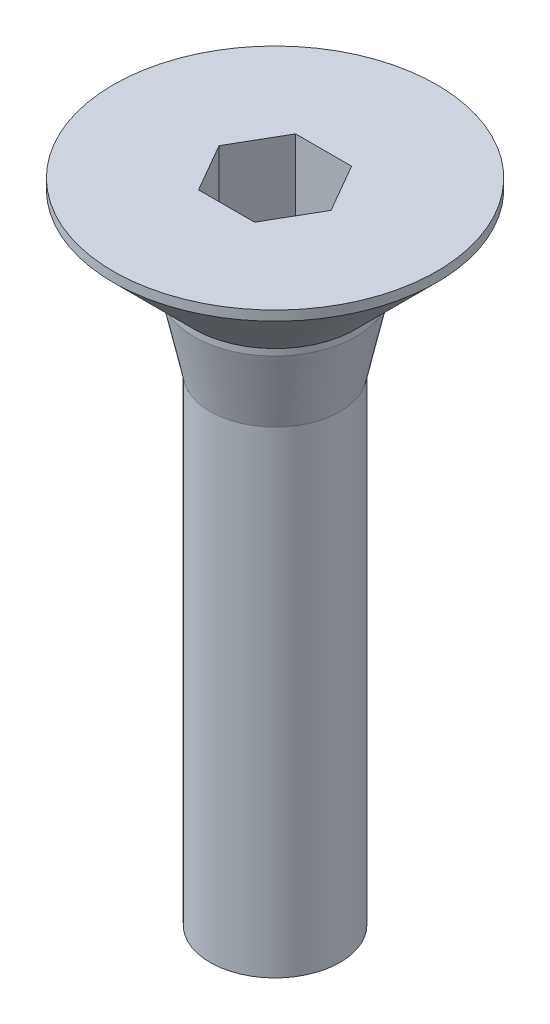
ISO-10303-21;
HEADER;
FILE_DESCRIPTION(('STEP AP214'),'2;1');
FILE_NAME('part.step','',(''),(''),'','','');
FILE_SCHEMA(('AUTOMOTIVE_DESIGN { 1 0 10303 214 1 1 1 1 }'));
ENDSEC;
DATA;
#1=APPLICATION_CONTEXT('core data for automotive mechanical design processes');
#2=APPLICATION_PROTOCOL_DEFINITION('international standard','automotive_design',2000,#1);
#3=PRODUCT_CONTEXT('',#1,'mechanical');
#4=PRODUCT('Part','Part','',(#3));
#5=PRODUCT_RELATED_PRODUCT_CATEGORY('part','',(#4));
#6=PRODUCT_DEFINITION_FORMATION('','',#4);
#7=PRODUCT_DEFINITION_CONTEXT('part definition',#1,'design');
#8=PRODUCT_DEFINITION('design','',#6,#7);
#9=PRODUCT_DEFINITION_SHAPE('','',#8);
#10=(LENGTH_UNIT() NAMED_UNIT(*) SI_UNIT(.MILLI.,.METRE.));
#11=(NAMED_UNIT(*) PLANE_ANGLE_UNIT() SI_UNIT($,.RADIAN.));
#12=(NAMED_UNIT(*) SI_UNIT($,.STERADIAN.) SOLID_ANGLE_UNIT());
#13=UNCERTAINTY_MEASURE_WITH_UNIT(LENGTH_MEASURE(1.E-05),#10,'distance_accuracy_value','');
#14=(GEOMETRIC_REPRESENTATION_CONTEXT(3) GLOBAL_UNCERTAINTY_ASSIGNED_CONTEXT((#13)) GLOBAL_UNIT_ASSIGNED_CONTEXT((#10,
#11,#12)) REPRESENTATION_CONTEXT('',''));
#15=CARTESIAN_POINT('',(0.,0.,0.));
#16=DIRECTION('',(0.,0.,1.));
#17=DIRECTION('',(1.,0.,0.));
#18=AXIS2_PLACEMENT_3D('',#15,#16,#17);
#19=CARTESIAN_POINT('',(0.,0.,0.));
#20=DIRECTION('',(0.,-1.,0.));
#21=DIRECTION('',(1.,0.,0.));
#22=AXIS2_PLACEMENT_3D('',#19,#20,#21);
#23=PLANE('',#22);
#24=DIRECTION('',(1.,0.,0.));
#25=VECTOR('',#24,1.);
#26=CARTESIAN_POINT('',(-0.866025403784437,0.,1.5));
#27=LINE('',#26,#25);
#28=CARTESIAN_POINT('',(-0.866025403784437,0.,1.5));
#29=VERTEX_POINT('',#28);
#30=CARTESIAN_POINT('',(0.866025403784437,0.,1.5));
#31=VERTEX_POINT('',#30);
#32=EDGE_CURVE('E121',#29,#31,#27,.T.);
#33=ORIENTED_EDGE('',*,*,#32,.F.);
#34=DIRECTION('',(0.499999999999998,0.,0.86602540378444));
#35=VECTOR('',#34,1.);
#36=CARTESIAN_POINT('',(-0.866025403784437,0.,1.5));
#37=LINE('',#36,#35);
#38=CARTESIAN_POINT('',(-1.73205080756887,0.,0.));
#39=VERTEX_POINT('',#38);
#40=EDGE_CURVE('E47',#39,#29,#37,.T.);
#41=ORIENTED_EDGE('',*,*,#40,.F.);
#42=DIRECTION('',(-0.499999999999998,0.,0.86602540378444));
#43=VECTOR('',#42,1.);
#44=CARTESIAN_POINT('',(-0.866025403784438,0.,-1.5));
#45=LINE('',#44,#43);
#46=CARTESIAN_POINT('',(-0.866025403784438,0.,-1.5));
#47=VERTEX_POINT('',#46);
#48=EDGE_CURVE('E130',#47,#39,#45,.T.);
#49=ORIENTED_EDGE('',*,*,#48,.F.);
#50=DIRECTION('',(-1.,0.,0.));
#51=VECTOR('',#50,1.);
#52=CARTESIAN_POINT('',(-0.866025403784438,0.,-1.5));
#53=LINE('',#52,#51);
#54=CARTESIAN_POINT('',(0.866025403784437,0.,-1.5));
#55=VERTEX_POINT('',#54);
#56=EDGE_CURVE('E128',#55,#47,#53,.T.);
#57=ORIENTED_EDGE('',*,*,#56,.F.);
#58=DIRECTION('',(-0.499999999999998,0.,-0.86602540378444));
#59=VECTOR('',#58,1.);
#60=CARTESIAN_POINT('',(0.866025403784437,0.,-1.5));
#61=LINE('',#60,#59);
#62=CARTESIAN_POINT('',(1.73205080756887,0.,0.));
#63=VERTEX_POINT('',#62);
#64=EDGE_CURVE('E95',#63,#55,#61,.T.);
#65=ORIENTED_EDGE('',*,*,#64,.F.);
#66=DIRECTION('',(0.499999999999998,0.,-0.86602540378444));
#67=VECTOR('',#66,1.);
#68=CARTESIAN_POINT('',(0.866025403784437,0.,1.5));
#69=LINE('',#68,#67);
#70=EDGE_CURVE('E124',#31,#63,#69,.T.);
#71=ORIENTED_EDGE('',*,*,#70,.F.);
#72=EDGE_LOOP('',(#33,#41,#49,#57,#65,#71));
#73=FACE_BOUND('',#72,.T.);
#74=CARTESIAN_POINT('',(0.,0.,0.));
#75=DIRECTION('',(0.,1.,0.));
#76=DIRECTION('',(-1.,0.,0.));
#77=AXIS2_PLACEMENT_3D('',#74,#75,#76);
#78=CIRCLE('',#77,5.);
#79=CARTESIAN_POINT('',(-5.,0.,0.));
#80=VERTEX_POINT('',#79);
#81=EDGE_CURVE('E11',#80,#80,#78,.T.);
#82=ORIENTED_EDGE('',*,*,#81,.T.);
#83=EDGE_LOOP('',(#82));
#84=FACE_BOUND('',#83,.T.);
#85=ADVANCED_FACE('F33',(#73,#84),#23,.F.);
#86=CARTESIAN_POINT('',(0.,0.,0.));
#87=DIRECTION('',(0.,1.,0.));
#88=DIRECTION('',(-1.,0.,0.));
#89=AXIS2_PLACEMENT_3D('',#86,#87,#88);
#90=CYLINDRICAL_SURFACE('',#89,5.);
#91=ORIENTED_EDGE('',*,*,#81,.F.);
#92=EDGE_LOOP('',(#91));
#93=FACE_BOUND('',#92,.T.);
#94=CARTESIAN_POINT('',(0.,-0.299999999999969,0.));
#95=DIRECTION('',(0.,1.,0.));
#96=DIRECTION('',(-1.,0.,0.));
#97=AXIS2_PLACEMENT_3D('',#94,#95,#96);
#98=CIRCLE('',#97,5.);
#99=CARTESIAN_POINT('',(-5.,-0.29999999999997,0.));
#100=VERTEX_POINT('',#99);
#101=EDGE_CURVE('E40',#100,#100,#98,.T.);
#102=ORIENTED_EDGE('',*,*,#101,.T.);
#103=EDGE_LOOP('',(#102));
#104=FACE_BOUND('',#103,.T.);
#105=ADVANCED_FACE('F153',(#93,#104),#90,.T.);
#106=CARTESIAN_POINT('',(0.,-2.8,0.));
#107=DIRECTION('',(0.,1.,0.));
#108=DIRECTION('',(-1.,0.,0.));
#109=AXIS2_PLACEMENT_3D('',#106,#107,#108);
#110=CONICAL_SURFACE('',#109,2.5,0.785398163397442);
#111=ORIENTED_EDGE('',*,*,#101,.F.);
#112=EDGE_LOOP('',(#111));
#113=FACE_BOUND('',#112,.T.);
#114=CARTESIAN_POINT('',(0.,-2.8,0.));
#115=DIRECTION('',(0.,1.,0.));
#116=DIRECTION('',(-1.,0.,0.));
#117=AXIS2_PLACEMENT_3D('',#114,#115,#116);
#118=CIRCLE('',#117,2.5);
#119=CARTESIAN_POINT('',(-2.5,-2.8,0.));
#120=VERTEX_POINT('',#119);
#121=EDGE_CURVE('E148',#120,#120,#118,.T.);
#122=ORIENTED_EDGE('',*,*,#121,.T.);
#123=EDGE_LOOP('',(#122));
#124=FACE_BOUND('',#123,.T.);
#125=ADVANCED_FACE('F155',(#113,#124),#110,.T.);
#126=CARTESIAN_POINT('',(0.,0.,0.));
#127=DIRECTION('',(0.,1.,0.));
#128=DIRECTION('',(-1.,0.,0.));
#129=AXIS2_PLACEMENT_3D('',#126,#127,#128);
#130=CYLINDRICAL_SURFACE('',#129,2.5);
#131=ORIENTED_EDGE('',*,*,#121,.F.);
#132=EDGE_LOOP('',(#131));
#133=FACE_BOUND('',#132,.T.);
#134=CARTESIAN_POINT('',(0.,-3.,0.));
#135=DIRECTION('',(0.,1.,0.));
#136=DIRECTION('',(-1.,0.,0.));
#137=AXIS2_PLACEMENT_3D('',#134,#135,#136);
#138=CIRCLE('',#137,2.5);
#139=CARTESIAN_POINT('',(-2.5,-3.,0.));
#140=VERTEX_POINT('',#139);
#141=EDGE_CURVE('E145',#140,#140,#138,.T.);
#142=ORIENTED_EDGE('',*,*,#141,.T.);
#143=EDGE_LOOP('',(#142));
#144=FACE_BOUND('',#143,.T.);
#145=ADVANCED_FACE('F158',(#133,#144),#130,.T.);
#146=CARTESIAN_POINT('',(0.,-5.25,0.));
#147=DIRECTION('',(0.,1.,0.));
#148=DIRECTION('',(-1.,0.,0.));
#149=AXIS2_PLACEMENT_3D('',#146,#147,#148);
#150=CONICAL_SURFACE('',#149,2.0095,0.214641837504207);
#151=ORIENTED_EDGE('',*,*,#141,.F.);
#152=EDGE_LOOP('',(#151));
#153=FACE_BOUND('',#152,.T.);
#154=CARTESIAN_POINT('',(0.,-5.25,0.));
#155=DIRECTION('',(0.,1.,0.));
#156=DIRECTION('',(-1.,0.,0.));
#157=AXIS2_PLACEMENT_3D('',#154,#155,#156);
#158=CIRCLE('',#157,2.0095);
#159=CARTESIAN_POINT('',(-2.0095,-5.25,0.));
#160=VERTEX_POINT('',#159);
#161=EDGE_CURVE('E142',#160,#160,#158,.T.);
#162=ORIENTED_EDGE('',*,*,#161,.T.);
#163=EDGE_LOOP('',(#162));
#164=FACE_BOUND('',#163,.T.);
#165=ADVANCED_FACE('F164',(#153,#164),#150,.T.);
#166=CARTESIAN_POINT('',(0.,0.,0.));
#167=DIRECTION('',(0.,1.,0.));
#168=DIRECTION('',(-1.,0.,0.));
#169=AXIS2_PLACEMENT_3D('',#166,#167,#168);
#170=CYLINDRICAL_SURFACE('',#169,2.0095);
#171=ORIENTED_EDGE('',*,*,#161,.F.);
#172=EDGE_LOOP('',(#171));
#173=FACE_BOUND('',#172,.T.);
#174=CARTESIAN_POINT('',(0.,-20.,0.));
#175=DIRECTION('',(0.,1.,0.));
#176=DIRECTION('',(-1.,0.,0.));
#177=AXIS2_PLACEMENT_3D('',#174,#175,#176);
#178=CIRCLE('',#177,2.0095);
#179=CARTESIAN_POINT('',(-2.0095,-20.,0.));
#180=VERTEX_POINT('',#179);
#181=EDGE_CURVE('E134',#180,#180,#178,.T.);
#182=ORIENTED_EDGE('',*,*,#181,.T.);
#183=EDGE_LOOP('',(#182));
#184=FACE_BOUND('',#183,.T.);
#185=ADVANCED_FACE('F170',(#173,#184),#170,.T.);
#186=CARTESIAN_POINT('',(2.0095,-20.,0.));
#187=DIRECTION('',(0.,1.,0.));
#188=DIRECTION('',(-1.,0.,0.));
#189=AXIS2_PLACEMENT_3D('',#186,#187,#188);
#190=PLANE('',#189);
#191=ORIENTED_EDGE('',*,*,#181,.F.);
#192=EDGE_LOOP('',(#191));
#193=FACE_BOUND('',#192,.T.);
#194=ADVANCED_FACE('F176',(#193),#190,.F.);
#195=CARTESIAN_POINT('',(-0.866025403784437,-5.3,1.5));
#196=DIRECTION('',(-0.86602540378444,0.,0.499999999999998));
#197=DIRECTION('',(0.499999999999998,0.,0.86602540378444));
#198=AXIS2_PLACEMENT_3D('',#195,#196,#197);
#199=PLANE('',#198);
#200=ORIENTED_EDGE('',*,*,#40,.T.);
#201=DIRECTION('',(0.,1.,0.));
#202=VECTOR('',#201,1.);
#203=CARTESIAN_POINT('',(-0.866025403784437,-5.3,1.5));
#204=LINE('',#203,#202);
#205=CARTESIAN_POINT('',(-0.866025403784437,-5.3,1.5));
#206=VERTEX_POINT('',#205);
#207=EDGE_CURVE('E77',#206,#29,#204,.T.);
#208=ORIENTED_EDGE('',*,*,#207,.F.);
#209=DIRECTION('',(0.499999999999998,0.,0.86602540378444));
#210=VECTOR('',#209,1.);
#211=CARTESIAN_POINT('',(-0.866025403784437,-5.3,1.5));
#212=LINE('',#211,#210);
#213=CARTESIAN_POINT('',(-1.73205080756887,-5.3,0.));
#214=VERTEX_POINT('',#213);
#215=EDGE_CURVE('E132',#214,#206,#212,.T.);
#216=ORIENTED_EDGE('',*,*,#215,.F.);
#217=DIRECTION('',(0.,1.,0.));
#218=VECTOR('',#217,1.);
#219=CARTESIAN_POINT('',(-1.73205080756887,-5.3,0.));
#220=LINE('',#219,#218);
#221=EDGE_CURVE('E55',#214,#39,#220,.T.);
#222=ORIENTED_EDGE('',*,*,#221,.T.);
#223=EDGE_LOOP('',(#200,#208,#216,#222));
#224=FACE_BOUND('',#223,.T.);
#225=ADVANCED_FACE('F181',(#224),#199,.F.);
#226=CARTESIAN_POINT('',(-0.866025403784438,-5.3,-1.5));
#227=DIRECTION('',(-0.86602540378444,0.,-0.499999999999998));
#228=DIRECTION('',(-0.499999999999998,0.,0.86602540378444));
#229=AXIS2_PLACEMENT_3D('',#226,#227,#228);
#230=PLANE('',#229);
#231=ORIENTED_EDGE('',*,*,#48,.T.);
#232=ORIENTED_EDGE('',*,*,#221,.F.);
#233=DIRECTION('',(-0.499999999999998,0.,0.86602540378444));
#234=VECTOR('',#233,1.);
#235=CARTESIAN_POINT('',(-0.866025403784438,-5.3,-1.5));
#236=LINE('',#235,#234);
#237=CARTESIAN_POINT('',(-0.866025403784438,-5.3,-1.5));
#238=VERTEX_POINT('',#237);
#239=EDGE_CURVE('E107',#238,#214,#236,.T.);
#240=ORIENTED_EDGE('',*,*,#239,.F.);
#241=DIRECTION('',(0.,1.,0.));
#242=VECTOR('',#241,1.);
#243=CARTESIAN_POINT('',(-0.866025403784438,-5.3,-1.5));
#244=LINE('',#243,#242);
#245=EDGE_CURVE('E99',#238,#47,#244,.T.);
#246=ORIENTED_EDGE('',*,*,#245,.T.);
#247=EDGE_LOOP('',(#231,#232,#240,#246));
#248=FACE_BOUND('',#247,.T.);
#249=ADVANCED_FACE('F186',(#248),#230,.F.);
#250=CARTESIAN_POINT('',(-0.866025403784438,-5.3,-1.5));
#251=DIRECTION('',(0.,0.,-1.));
#252=DIRECTION('',(-1.,0.,0.));
#253=AXIS2_PLACEMENT_3D('',#250,#251,#252);
#254=PLANE('',#253);
#255=ORIENTED_EDGE('',*,*,#56,.T.);
#256=ORIENTED_EDGE('',*,*,#245,.F.);
#257=DIRECTION('',(-1.,0.,0.));
#258=VECTOR('',#257,1.);
#259=CARTESIAN_POINT('',(-0.866025403784438,-5.3,-1.5));
#260=LINE('',#259,#258);
#261=CARTESIAN_POINT('',(0.866025403784437,-5.3,-1.5));
#262=VERTEX_POINT('',#261);
#263=EDGE_CURVE('E103',#262,#238,#260,.T.);
#264=ORIENTED_EDGE('',*,*,#263,.F.);
#265=DIRECTION('',(0.,1.,0.));
#266=VECTOR('',#265,1.);
#267=CARTESIAN_POINT('',(0.866025403784437,-5.3,-1.5));
#268=LINE('',#267,#266);
#269=EDGE_CURVE('E88',#262,#55,#268,.T.);
#270=ORIENTED_EDGE('',*,*,#269,.T.);
#271=EDGE_LOOP('',(#255,#256,#264,#270));
#272=FACE_BOUND('',#271,.T.);
#273=ADVANCED_FACE('F104',(#272),#254,.F.);
#274=CARTESIAN_POINT('',(0.866025403784437,-5.3,-1.5));
#275=DIRECTION('',(0.86602540378444,0.,-0.499999999999998));
#276=DIRECTION('',(-0.499999999999998,0.,-0.86602540378444));
#277=AXIS2_PLACEMENT_3D('',#274,#275,#276);
#278=PLANE('',#277);
#279=ORIENTED_EDGE('',*,*,#64,.T.);
#280=ORIENTED_EDGE('',*,*,#269,.F.);
#281=DIRECTION('',(-0.499999999999998,0.,-0.86602540378444));
#282=VECTOR('',#281,1.);
#283=CARTESIAN_POINT('',(0.866025403784437,-5.3,-1.5));
#284=LINE('',#283,#282);
#285=CARTESIAN_POINT('',(1.73205080756887,-5.3,0.));
#286=VERTEX_POINT('',#285);
#287=EDGE_CURVE('E92',#286,#262,#284,.T.);
#288=ORIENTED_EDGE('',*,*,#287,.F.);
#289=DIRECTION('',(0.,1.,0.));
#290=VECTOR('',#289,1.);
#291=CARTESIAN_POINT('',(1.73205080756887,-5.3,0.));
#292=LINE('',#291,#290);
#293=EDGE_CURVE('E100',#286,#63,#292,.T.);
#294=ORIENTED_EDGE('',*,*,#293,.T.);
#295=EDGE_LOOP('',(#279,#280,#288,#294));
#296=FACE_BOUND('',#295,.T.);
#297=ADVANCED_FACE('F90',(#296),#278,.F.);
#298=CARTESIAN_POINT('',(0.866025403784437,-5.3,1.5));
#299=DIRECTION('',(0.86602540378444,0.,0.499999999999998));
#300=DIRECTION('',(0.499999999999998,0.,-0.86602540378444));
#301=AXIS2_PLACEMENT_3D('',#298,#299,#300);
#302=PLANE('',#301);
#303=ORIENTED_EDGE('',*,*,#70,.T.);
#304=ORIENTED_EDGE('',*,*,#293,.F.);
#305=DIRECTION('',(0.499999999999998,0.,-0.86602540378444));
#306=VECTOR('',#305,1.);
#307=CARTESIAN_POINT('',(0.866025403784437,-5.3,1.5));
#308=LINE('',#307,#306);
#309=CARTESIAN_POINT('',(0.866025403784437,-5.3,1.5));
#310=VERTEX_POINT('',#309);
#311=EDGE_CURVE('E113',#310,#286,#308,.T.);
#312=ORIENTED_EDGE('',*,*,#311,.F.);
#313=DIRECTION('',(0.,1.,0.));
#314=VECTOR('',#313,1.);
#315=CARTESIAN_POINT('',(0.866025403784437,-5.3,1.5));
#316=LINE('',#315,#314);
#317=EDGE_CURVE('E137',#310,#31,#316,.T.);
#318=ORIENTED_EDGE('',*,*,#317,.T.);
#319=EDGE_LOOP('',(#303,#304,#312,#318));
#320=FACE_BOUND('',#319,.T.);
#321=ADVANCED_FACE('F212',(#320),#302,.F.);
#322=CARTESIAN_POINT('',(-0.866025403784437,-5.3,1.5));
#323=DIRECTION('',(0.,0.,1.));
#324=DIRECTION('',(1.,0.,0.));
#325=AXIS2_PLACEMENT_3D('',#322,#323,#324);
#326=PLANE('',#325);
#327=ORIENTED_EDGE('',*,*,#32,.T.);
#328=ORIENTED_EDGE('',*,*,#317,.F.);
#329=DIRECTION('',(1.,0.,0.));
#330=VECTOR('',#329,1.);
#331=CARTESIAN_POINT('',(-0.866025403784437,-5.3,1.5));
#332=LINE('',#331,#330);
#333=EDGE_CURVE('E115',#206,#310,#332,.T.);
#334=ORIENTED_EDGE('',*,*,#333,.F.);
#335=ORIENTED_EDGE('',*,*,#207,.T.);
#336=EDGE_LOOP('',(#327,#328,#334,#335));
#337=FACE_BOUND('',#336,.T.);
#338=ADVANCED_FACE('F200',(#337),#326,.F.);
#339=CARTESIAN_POINT('',(-0.866025403784437,-5.3,1.5));
#340=DIRECTION('',(0.,-1.,0.));
#341=DIRECTION('',(0.,0.,-1.));
#342=AXIS2_PLACEMENT_3D('',#339,#340,#341);
#343=PLANE('',#342);
#344=ORIENTED_EDGE('',*,*,#215,.T.);
#345=ORIENTED_EDGE('',*,*,#333,.T.);
#346=ORIENTED_EDGE('',*,*,#311,.T.);
#347=ORIENTED_EDGE('',*,*,#287,.T.);
#348=ORIENTED_EDGE('',*,*,#263,.T.);
#349=ORIENTED_EDGE('',*,*,#239,.T.);
#350=EDGE_LOOP('',(#344,#345,#346,#347,#348,#349));
#351=FACE_BOUND('',#350,.T.);
#352=ADVANCED_FACE('F110',(#351),#343,.F.);
#353=CLOSED_SHELL('',(#85,#105,#125,#145,#165,#185,#194,#225,#249,#273,#297,#321,#338,#352));
#354=MANIFOLD_SOLID_BREP('B2',#353);
#355=ADVANCED_BREP_SHAPE_REPRESENTATION('',(#18,#354),#14);
#356=SHAPE_DEFINITION_REPRESENTATION(#9,#355);
ENDSEC;
END-ISO-10303-21;
